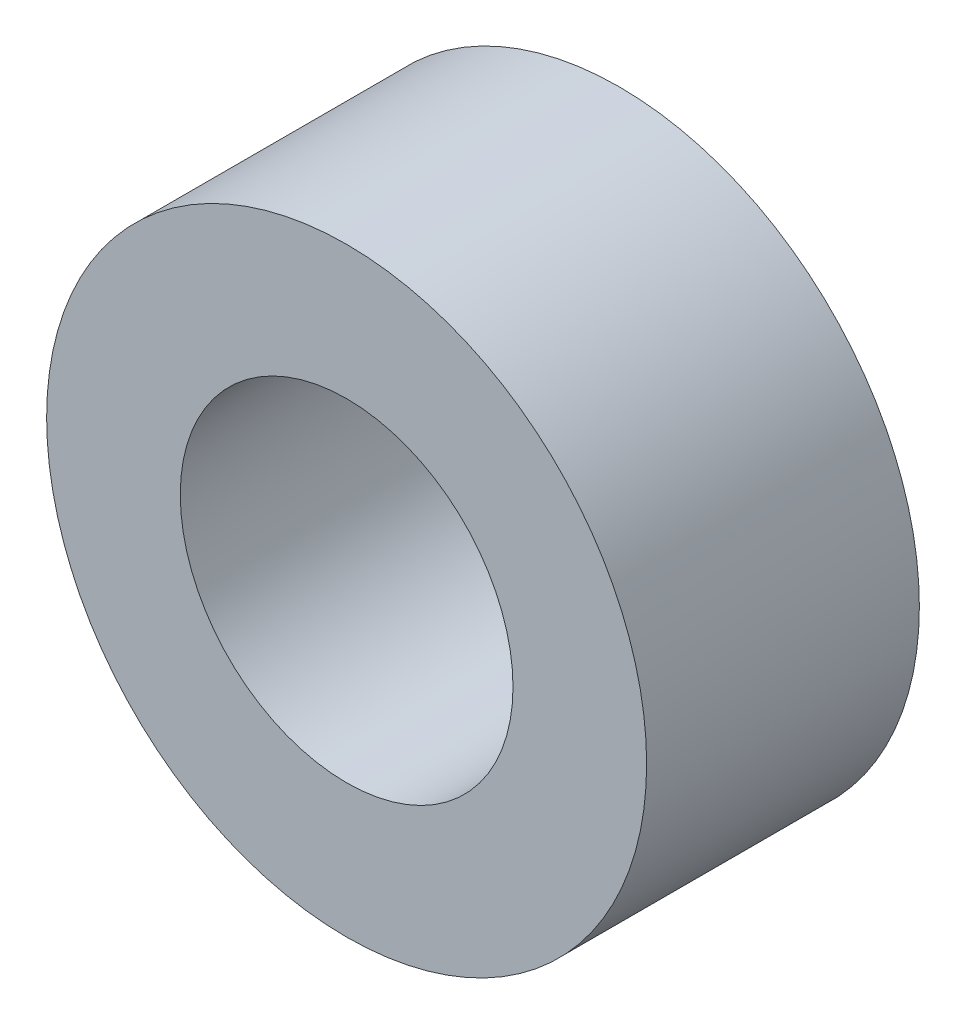
ISO-10303-21;
HEADER;
FILE_DESCRIPTION(('STEP AP214'),'2;1');
FILE_NAME('part.step','',(''),(''),'','','');
FILE_SCHEMA(('AUTOMOTIVE_DESIGN { 1 0 10303 214 1 1 1 1 }'));
ENDSEC;
DATA;
#1=APPLICATION_CONTEXT('core data for automotive mechanical design processes');
#2=APPLICATION_PROTOCOL_DEFINITION('international standard','automotive_design',2000,#1);
#3=PRODUCT_CONTEXT('',#1,'mechanical');
#4=PRODUCT('Part','Part','',(#3));
#5=PRODUCT_RELATED_PRODUCT_CATEGORY('part','',(#4));
#6=PRODUCT_DEFINITION_FORMATION('','',#4);
#7=PRODUCT_DEFINITION_CONTEXT('part definition',#1,'design');
#8=PRODUCT_DEFINITION('design','',#6,#7);
#9=PRODUCT_DEFINITION_SHAPE('','',#8);
#10=(LENGTH_UNIT() NAMED_UNIT(*) SI_UNIT(.MILLI.,.METRE.));
#11=(NAMED_UNIT(*) PLANE_ANGLE_UNIT() SI_UNIT($,.RADIAN.));
#12=(NAMED_UNIT(*) SI_UNIT($,.STERADIAN.) SOLID_ANGLE_UNIT());
#13=UNCERTAINTY_MEASURE_WITH_UNIT(LENGTH_MEASURE(1.E-05),#10,'distance_accuracy_value','');
#14=(GEOMETRIC_REPRESENTATION_CONTEXT(3) GLOBAL_UNCERTAINTY_ASSIGNED_CONTEXT((#13)) GLOBAL_UNIT_ASSIGNED_CONTEXT((#10,
#11,#12)) REPRESENTATION_CONTEXT('',''));
#15=CARTESIAN_POINT('',(0.,0.,0.));
#16=DIRECTION('',(0.,0.,1.));
#17=DIRECTION('',(1.,0.,0.));
#18=AXIS2_PLACEMENT_3D('',#15,#16,#17);
#19=CARTESIAN_POINT('',(0.,0.,5.));
#20=DIRECTION('',(0.,0.,1.));
#21=DIRECTION('',(1.,0.,0.));
#22=AXIS2_PLACEMENT_3D('',#19,#20,#21);
#23=PLANE('',#22);
#24=CARTESIAN_POINT('',(0.,0.,5.));
#25=DIRECTION('',(0.,0.,1.));
#26=DIRECTION('',(1.,0.,0.));
#27=AXIS2_PLACEMENT_3D('',#24,#25,#26);
#28=CIRCLE('',#27,5.5);
#29=CARTESIAN_POINT('',(5.5,0.,5.));
#30=VERTEX_POINT('',#29);
#31=EDGE_CURVE('E10',#30,#30,#28,.T.);
#32=ORIENTED_EDGE('',*,*,#31,.T.);
#33=EDGE_LOOP('',(#32));
#34=FACE_BOUND('',#33,.T.);
#35=CARTESIAN_POINT('',(0.,0.,5.));
#36=DIRECTION('',(0.,0.,1.));
#37=DIRECTION('',(1.,0.,0.));
#38=AXIS2_PLACEMENT_3D('',#35,#36,#37);
#39=CIRCLE('',#38,3.05);
#40=CARTESIAN_POINT('',(3.05,0.,5.));
#41=VERTEX_POINT('',#40);
#42=EDGE_CURVE('E47',#41,#41,#39,.T.);
#43=ORIENTED_EDGE('',*,*,#42,.F.);
#44=EDGE_LOOP('',(#43));
#45=FACE_BOUND('',#44,.T.);
#46=ADVANCED_FACE('F36',(#34,#45),#23,.T.);
#47=CARTESIAN_POINT('',(0.,0.,0.));
#48=DIRECTION('',(0.,0.,1.));
#49=DIRECTION('',(1.,0.,0.));
#50=AXIS2_PLACEMENT_3D('',#47,#48,#49);
#51=PLANE('',#50);
#52=CARTESIAN_POINT('',(0.,0.,0.));
#53=DIRECTION('',(0.,0.,1.));
#54=DIRECTION('',(1.,0.,0.));
#55=AXIS2_PLACEMENT_3D('',#52,#53,#54);
#56=CIRCLE('',#55,5.5);
#57=CARTESIAN_POINT('',(5.5,0.,0.));
#58=VERTEX_POINT('',#57);
#59=EDGE_CURVE('E40',#58,#58,#56,.T.);
#60=ORIENTED_EDGE('',*,*,#59,.F.);
#61=EDGE_LOOP('',(#60));
#62=FACE_BOUND('',#61,.T.);
#63=CARTESIAN_POINT('',(0.,0.,0.));
#64=DIRECTION('',(0.,0.,1.));
#65=DIRECTION('',(1.,0.,0.));
#66=AXIS2_PLACEMENT_3D('',#63,#64,#65);
#67=CIRCLE('',#66,3.05);
#68=CARTESIAN_POINT('',(3.05,0.,0.));
#69=VERTEX_POINT('',#68);
#70=EDGE_CURVE('E49',#69,#69,#67,.T.);
#71=ORIENTED_EDGE('',*,*,#70,.T.);
#72=EDGE_LOOP('',(#71));
#73=FACE_BOUND('',#72,.T.);
#74=ADVANCED_FACE('F59',(#62,#73),#51,.F.);
#75=CARTESIAN_POINT('',(0.,0.,5.));
#76=DIRECTION('',(0.,0.,-1.));
#77=DIRECTION('',(-1.,0.,0.));
#78=AXIS2_PLACEMENT_3D('',#75,#76,#77);
#79=CYLINDRICAL_SURFACE('',#78,5.5);
#80=ORIENTED_EDGE('',*,*,#31,.F.);
#81=EDGE_LOOP('',(#80));
#82=FACE_BOUND('',#81,.T.);
#83=ORIENTED_EDGE('',*,*,#59,.T.);
#84=EDGE_LOOP('',(#83));
#85=FACE_BOUND('',#84,.T.);
#86=ADVANCED_FACE('F38',(#82,#85),#79,.T.);
#87=CARTESIAN_POINT('',(0.,0.,5.));
#88=DIRECTION('',(0.,0.,-1.));
#89=DIRECTION('',(-1.,0.,0.));
#90=AXIS2_PLACEMENT_3D('',#87,#88,#89);
#91=CYLINDRICAL_SURFACE('',#90,3.05);
#92=ORIENTED_EDGE('',*,*,#42,.T.);
#93=EDGE_LOOP('',(#92));
#94=FACE_BOUND('',#93,.T.);
#95=ORIENTED_EDGE('',*,*,#70,.F.);
#96=EDGE_LOOP('',(#95));
#97=FACE_BOUND('',#96,.T.);
#98=ADVANCED_FACE('F55',(#94,#97),#91,.F.);
#99=CLOSED_SHELL('',(#46,#74,#86,#98));
#100=MANIFOLD_SOLID_BREP('B2',#99);
#101=ADVANCED_BREP_SHAPE_REPRESENTATION('',(#18,#100),#14);
#102=SHAPE_DEFINITION_REPRESENTATION(#9,#101);
ENDSEC;
END-ISO-10303-21;
